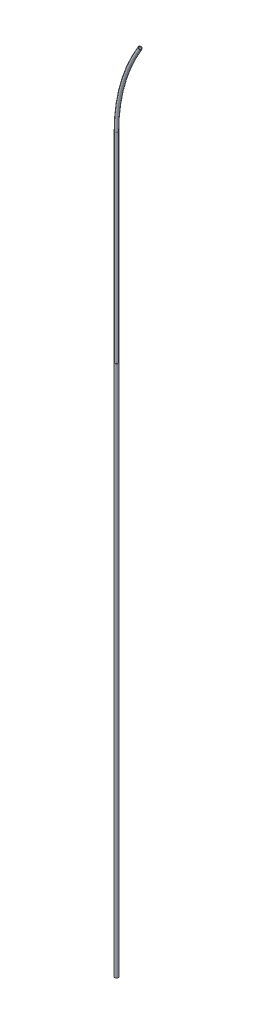
ISO-10303-21;
HEADER;
FILE_DESCRIPTION(('STEP AP214'),'2;1');
FILE_NAME('part.step','',(''),(''),'','','');
FILE_SCHEMA(('AUTOMOTIVE_DESIGN { 1 0 10303 214 1 1 1 1 }'));
ENDSEC;
DATA;
#1=APPLICATION_CONTEXT('core data for automotive mechanical design processes');
#2=APPLICATION_PROTOCOL_DEFINITION('international standard','automotive_design',2000,#1);
#3=PRODUCT_CONTEXT('',#1,'mechanical');
#4=PRODUCT('Part','Part','',(#3));
#5=PRODUCT_RELATED_PRODUCT_CATEGORY('part','',(#4));
#6=PRODUCT_DEFINITION_FORMATION('','',#4);
#7=PRODUCT_DEFINITION_CONTEXT('part definition',#1,'design');
#8=PRODUCT_DEFINITION('design','',#6,#7);
#9=PRODUCT_DEFINITION_SHAPE('','',#8);
#10=(LENGTH_UNIT() NAMED_UNIT(*) SI_UNIT(.MILLI.,.METRE.));
#11=(NAMED_UNIT(*) PLANE_ANGLE_UNIT() SI_UNIT($,.RADIAN.));
#12=(NAMED_UNIT(*) SI_UNIT($,.STERADIAN.) SOLID_ANGLE_UNIT());
#13=UNCERTAINTY_MEASURE_WITH_UNIT(LENGTH_MEASURE(1.E-05),#10,'distance_accuracy_value','');
#14=(GEOMETRIC_REPRESENTATION_CONTEXT(3) GLOBAL_UNCERTAINTY_ASSIGNED_CONTEXT((#13)) GLOBAL_UNIT_ASSIGNED_CONTEXT((#10,
#11,#12)) REPRESENTATION_CONTEXT('',''));
#15=CARTESIAN_POINT('',(0.,0.,0.));
#16=DIRECTION('',(0.,0.,1.));
#17=DIRECTION('',(1.,0.,0.));
#18=AXIS2_PLACEMENT_3D('',#15,#16,#17);
#19=CARTESIAN_POINT('',(0.,-322.,0.));
#20=DIRECTION('',(0.,-1.,0.));
#21=DIRECTION('',(0.,0.,-1.));
#22=AXIS2_PLACEMENT_3D('',#19,#20,#21);
#23=PLANE('',#22);
#24=CARTESIAN_POINT('',(0.,-322.,0.));
#25=DIRECTION('',(0.,-1.,0.));
#26=DIRECTION('',(0.,0.,-1.));
#27=AXIS2_PLACEMENT_3D('',#24,#25,#26);
#28=CIRCLE('',#27,1.2065);
#29=CARTESIAN_POINT('',(0.,-322.,-1.2065));
#30=VERTEX_POINT('',#29);
#31=EDGE_CURVE('E11',#30,#30,#28,.T.);
#32=ORIENTED_EDGE('',*,*,#31,.T.);
#33=EDGE_LOOP('',(#32));
#34=FACE_BOUND('',#33,.T.);
#35=CARTESIAN_POINT('',(0.,-322.,0.));
#36=DIRECTION('',(0.,-1.,0.));
#37=DIRECTION('',(0.,0.,-1.));
#38=AXIS2_PLACEMENT_3D('',#35,#36,#37);
#39=CIRCLE('',#38,1.0795);
#40=CARTESIAN_POINT('',(0.,-322.,-1.0795));
#41=VERTEX_POINT('',#40);
#42=EDGE_CURVE('E64',#41,#41,#39,.T.);
#43=ORIENTED_EDGE('',*,*,#42,.F.);
#44=EDGE_LOOP('',(#43));
#45=FACE_BOUND('',#44,.T.);
#46=ADVANCED_FACE('F51',(#34,#45),#23,.T.);
#47=CARTESIAN_POINT('',(0.,10.,0.));
#48=DIRECTION('',(0.,-1.,0.));
#49=DIRECTION('',(0.,0.,-1.));
#50=AXIS2_PLACEMENT_3D('',#47,#48,#49);
#51=PLANE('',#50);
#52=CARTESIAN_POINT('',(0.,10.,0.));
#53=DIRECTION('',(0.,-1.,0.));
#54=DIRECTION('',(0.,0.,-1.));
#55=AXIS2_PLACEMENT_3D('',#52,#53,#54);
#56=CIRCLE('',#55,1.2065);
#57=CARTESIAN_POINT('',(0.,10.,-1.2065));
#58=VERTEX_POINT('',#57);
#59=EDGE_CURVE('E55',#58,#58,#56,.T.);
#60=ORIENTED_EDGE('',*,*,#59,.F.);
#61=EDGE_LOOP('',(#60));
#62=FACE_BOUND('',#61,.T.);
#63=CARTESIAN_POINT('',(0.,10.,0.));
#64=DIRECTION('',(0.,-1.,0.));
#65=DIRECTION('',(0.,0.,-1.));
#66=AXIS2_PLACEMENT_3D('',#63,#64,#65);
#67=CIRCLE('',#66,1.0795);
#68=CARTESIAN_POINT('',(0.,10.,-1.0795));
#69=VERTEX_POINT('',#68);
#70=EDGE_CURVE('E66',#69,#69,#67,.T.);
#71=ORIENTED_EDGE('',*,*,#70,.T.);
#72=EDGE_LOOP('',(#71));
#73=FACE_BOUND('',#72,.T.);
#74=ADVANCED_FACE('F78',(#62,#73),#51,.F.);
#75=CARTESIAN_POINT('',(0.,-322.,0.));
#76=DIRECTION('',(0.,1.,0.));
#77=DIRECTION('',(0.,0.,1.));
#78=AXIS2_PLACEMENT_3D('',#75,#76,#77);
#79=CYLINDRICAL_SURFACE('',#78,1.2065);
#80=ORIENTED_EDGE('',*,*,#31,.F.);
#81=EDGE_LOOP('',(#80));
#82=FACE_BOUND('',#81,.T.);
#83=ORIENTED_EDGE('',*,*,#59,.T.);
#84=EDGE_LOOP('',(#83));
#85=FACE_BOUND('',#84,.T.);
#86=ADVANCED_FACE('F53',(#82,#85),#79,.T.);
#87=CARTESIAN_POINT('',(0.,-322.,0.));
#88=DIRECTION('',(0.,1.,0.));
#89=DIRECTION('',(0.,0.,1.));
#90=AXIS2_PLACEMENT_3D('',#87,#88,#89);
#91=CYLINDRICAL_SURFACE('',#90,1.0795);
#92=ORIENTED_EDGE('',*,*,#42,.T.);
#93=EDGE_LOOP('',(#92));
#94=FACE_BOUND('',#93,.T.);
#95=ORIENTED_EDGE('',*,*,#70,.F.);
#96=EDGE_LOOP('',(#95));
#97=FACE_BOUND('',#96,.T.);
#98=ADVANCED_FACE('F74',(#94,#97),#91,.F.);
#99=CLOSED_SHELL('',(#46,#74,#86,#98));
#100=MANIFOLD_SOLID_BREP('B2',#99);
#101=CARTESIAN_POINT('',(0.,0.,0.));
#102=DIRECTION('',(0.,1.,0.));
#103=DIRECTION('',(0.,0.,1.));
#104=AXIS2_PLACEMENT_3D('',#101,#102,#103);
#105=PLANE('',#104);
#106=CARTESIAN_POINT('',(0.,0.,0.));
#107=DIRECTION('',(0.,1.,0.));
#108=DIRECTION('',(0.,0.,1.));
#109=AXIS2_PLACEMENT_3D('',#106,#107,#108);
#110=CIRCLE('',#109,1.016);
#111=CARTESIAN_POINT('',(0.,0.,1.016));
#112=VERTEX_POINT('',#111);
#113=EDGE_CURVE('E121',#112,#112,#110,.T.);
#114=ORIENTED_EDGE('',*,*,#113,.F.);
#115=EDGE_LOOP('',(#114));
#116=FACE_BOUND('',#115,.T.);
#117=CARTESIAN_POINT('',(0.,0.,0.));
#118=DIRECTION('',(0.,1.,0.));
#119=DIRECTION('',(0.,0.,1.));
#120=AXIS2_PLACEMENT_3D('',#117,#118,#119);
#121=CIRCLE('',#120,0.73);
#122=CARTESIAN_POINT('',(0.,0.,0.73));
#123=VERTEX_POINT('',#122);
#124=EDGE_CURVE('E128',#123,#123,#121,.T.);
#125=ORIENTED_EDGE('',*,*,#124,.T.);
#126=EDGE_LOOP('',(#125));
#127=FACE_BOUND('',#126,.T.);
#128=ADVANCED_FACE('F117',(#116,#127),#105,.F.);
#129=CARTESIAN_POINT('',(0.,135.,0.));
#130=DIRECTION('',(0.,-1.,0.));
#131=DIRECTION('',(0.,0.,-1.));
#132=AXIS2_PLACEMENT_3D('',#129,#130,#131);
#133=CYLINDRICAL_SURFACE('',#132,1.016);
#134=CARTESIAN_POINT('',(0.,135.,0.));
#135=DIRECTION('',(0.,1.,0.));
#136=DIRECTION('',(0.,0.,1.));
#137=AXIS2_PLACEMENT_3D('',#134,#135,#136);
#138=CIRCLE('',#137,1.016);
#139=CARTESIAN_POINT('',(-1.016,135.,0.));
#140=VERTEX_POINT('',#139);
#141=EDGE_CURVE('E50',#140,#140,#138,.T.);
#142=ORIENTED_EDGE('',*,*,#141,.F.);
#143=EDGE_LOOP('',(#142));
#144=FACE_BOUND('',#143,.T.);
#145=ORIENTED_EDGE('',*,*,#113,.T.);
#146=EDGE_LOOP('',(#145));
#147=FACE_BOUND('',#146,.T.);
#148=ADVANCED_FACE('F119',(#144,#147),#133,.T.);
#149=CARTESIAN_POINT('',(0.,135.,0.));
#150=DIRECTION('',(0.,-1.,0.));
#151=DIRECTION('',(0.,0.,-1.));
#152=AXIS2_PLACEMENT_3D('',#149,#150,#151);
#153=CYLINDRICAL_SURFACE('',#152,0.73);
#154=CARTESIAN_POINT('',(0.,135.,0.));
#155=DIRECTION('',(0.,1.,0.));
#156=DIRECTION('',(0.,0.,1.));
#157=AXIS2_PLACEMENT_3D('',#154,#155,#156);
#158=CIRCLE('',#157,0.73);
#159=CARTESIAN_POINT('',(-0.729999999999995,135.,0.));
#160=VERTEX_POINT('',#159);
#161=EDGE_CURVE('E136',#160,#160,#158,.F.);
#162=ORIENTED_EDGE('',*,*,#161,.F.);
#163=EDGE_LOOP('',(#162));
#164=FACE_BOUND('',#163,.T.);
#165=ORIENTED_EDGE('',*,*,#124,.F.);
#166=EDGE_LOOP('',(#165));
#167=FACE_BOUND('',#166,.T.);
#168=ADVANCED_FACE('F144',(#164,#167),#153,.F.);
#169=CARTESIAN_POINT('',(100.,135.,0.));
#170=DIRECTION('',(0.,0.,-1.));
#171=DIRECTION('',(-1.,0.,0.));
#172=AXIS2_PLACEMENT_3D('',#169,#170,#171);
#173=TOROIDAL_SURFACE('',#172,100.,1.016);
#174=CARTESIAN_POINT('',(14.7475477940494,187.268722893066,0.));
#175=DIRECTION('',(0.522687228930658,0.852524522059506,0.));
#176=DIRECTION('',(0.,0.,1.));
#177=AXIS2_PLACEMENT_3D('',#174,#175,#176);
#178=CIRCLE('',#177,1.016);
#179=CARTESIAN_POINT('',(13.8813828796369,187.799773117659,0.));
#180=VERTEX_POINT('',#179);
#181=EDGE_CURVE('E133',#180,#180,#178,.T.);
#182=CARTESIAN_POINT('',(100.,135.,0.));
#183=DIRECTION('',(0.,0.,-1.));
#184=DIRECTION('',(-1.,0.,0.));
#185=AXIS2_PLACEMENT_3D('',#182,#183,#184);
#186=CIRCLE('',#185,101.016);
#187=EDGE_CURVE('',#140,#180,#186,.T.);
#188=ORIENTED_EDGE('',*,*,#141,.T.);
#189=ORIENTED_EDGE('',*,*,#181,.F.);
#190=ORIENTED_EDGE('',*,*,#187,.T.);
#191=ORIENTED_EDGE('',*,*,#187,.F.);
#192=EDGE_LOOP('',(#188,#190,#189,#191));
#193=FACE_BOUND('',#192,.T.);
#194=ADVANCED_FACE('F147',(#193),#173,.T.);
#195=CARTESIAN_POINT('',(14.7475477940494,187.268722893066,0.));
#196=DIRECTION('',(0.522687228930658,0.852524522059506,0.));
#197=DIRECTION('',(0.,0.,1.));
#198=AXIS2_PLACEMENT_3D('',#195,#196,#197);
#199=PLANE('',#198);
#200=CARTESIAN_POINT('',(14.7475477940494,187.268722893066,0.));
#201=DIRECTION('',(0.522687228930658,0.852524522059506,0.));
#202=DIRECTION('',(0.,0.,1.));
#203=AXIS2_PLACEMENT_3D('',#200,#201,#202);
#204=CIRCLE('',#203,0.73);
#205=CARTESIAN_POINT('',(14.1252048929459,187.650284570185,0.));
#206=VERTEX_POINT('',#205);
#207=EDGE_CURVE('E132',#206,#206,#204,.F.);
#208=ORIENTED_EDGE('',*,*,#207,.T.);
#209=EDGE_LOOP('',(#208));
#210=FACE_BOUND('',#209,.T.);
#211=ORIENTED_EDGE('',*,*,#181,.T.);
#212=EDGE_LOOP('',(#211));
#213=FACE_BOUND('',#212,.T.);
#214=ADVANCED_FACE('F161',(#210,#213),#199,.T.);
#215=CARTESIAN_POINT('',(100.,135.,0.));
#216=DIRECTION('',(0.,0.,-1.));
#217=DIRECTION('',(-1.,0.,0.));
#218=AXIS2_PLACEMENT_3D('',#215,#216,#217);
#219=TOROIDAL_SURFACE('',#218,100.,0.73);
#220=CARTESIAN_POINT('',(100.,135.,0.));
#221=DIRECTION('',(0.,0.,-1.));
#222=DIRECTION('',(-1.,0.,0.));
#223=AXIS2_PLACEMENT_3D('',#220,#221,#222);
#224=CIRCLE('',#223,100.73);
#225=EDGE_CURVE('',#160,#206,#224,.T.);
#226=ORIENTED_EDGE('',*,*,#161,.T.);
#227=ORIENTED_EDGE('',*,*,#207,.F.);
#228=ORIENTED_EDGE('',*,*,#225,.T.);
#229=ORIENTED_EDGE('',*,*,#225,.F.);
#230=EDGE_LOOP('',(#226,#228,#227,#229));
#231=FACE_BOUND('',#230,.T.);
#232=ADVANCED_FACE('F142',(#231),#219,.F.);
#233=CLOSED_SHELL('',(#128,#148,#168,#194,#214,#232));
#234=MANIFOLD_SOLID_BREP('B6',#233);
#235=ADVANCED_BREP_SHAPE_REPRESENTATION('',(#18,#100,#234),#14);
#236=SHAPE_DEFINITION_REPRESENTATION(#9,#235);
ENDSEC;
END-ISO-10303-21;
